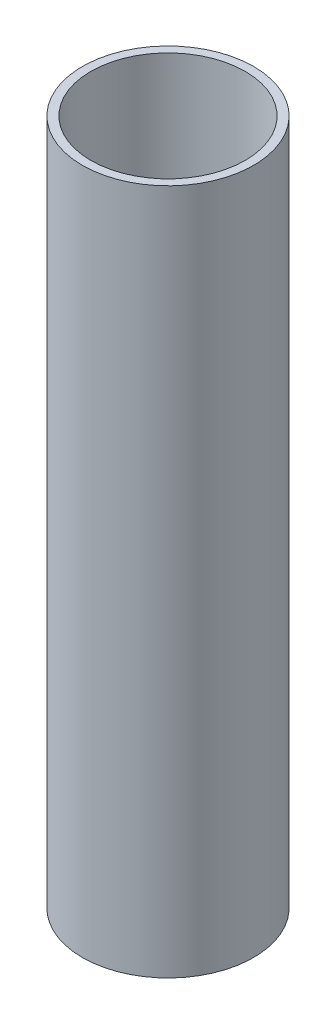
ISO-10303-21;
HEADER;
FILE_DESCRIPTION(('STEP AP214'),'2;1');
FILE_NAME('part.step','',(''),(''),'','','');
FILE_SCHEMA(('AUTOMOTIVE_DESIGN { 1 0 10303 214 1 1 1 1 }'));
ENDSEC;
DATA;
#1=APPLICATION_CONTEXT('core data for automotive mechanical design processes');
#2=APPLICATION_PROTOCOL_DEFINITION('international standard','automotive_design',2000,#1);
#3=PRODUCT_CONTEXT('',#1,'mechanical');
#4=PRODUCT('Part','Part','',(#3));
#5=PRODUCT_RELATED_PRODUCT_CATEGORY('part','',(#4));
#6=PRODUCT_DEFINITION_FORMATION('','',#4);
#7=PRODUCT_DEFINITION_CONTEXT('part definition',#1,'design');
#8=PRODUCT_DEFINITION('design','',#6,#7);
#9=PRODUCT_DEFINITION_SHAPE('','',#8);
#10=(LENGTH_UNIT() NAMED_UNIT(*) SI_UNIT(.MILLI.,.METRE.));
#11=(NAMED_UNIT(*) PLANE_ANGLE_UNIT() SI_UNIT($,.RADIAN.));
#12=(NAMED_UNIT(*) SI_UNIT($,.STERADIAN.) SOLID_ANGLE_UNIT());
#13=UNCERTAINTY_MEASURE_WITH_UNIT(LENGTH_MEASURE(1.E-05),#10,'distance_accuracy_value','');
#14=(GEOMETRIC_REPRESENTATION_CONTEXT(3) GLOBAL_UNCERTAINTY_ASSIGNED_CONTEXT((#13)) GLOBAL_UNIT_ASSIGNED_CONTEXT((#10,
#11,#12)) REPRESENTATION_CONTEXT('',''));
#15=CARTESIAN_POINT('',(0.,0.,0.));
#16=DIRECTION('',(0.,0.,1.));
#17=DIRECTION('',(1.,0.,0.));
#18=AXIS2_PLACEMENT_3D('',#15,#16,#17);
#19=CARTESIAN_POINT('',(0.,406.4,0.));
#20=DIRECTION('',(0.,1.,0.));
#21=DIRECTION('',(0.,0.,1.));
#22=AXIS2_PLACEMENT_3D('',#19,#20,#21);
#23=PLANE('',#22);
#24=CARTESIAN_POINT('',(0.,406.4,0.));
#25=DIRECTION('',(0.,1.,0.));
#26=DIRECTION('',(0.,0.,1.));
#27=AXIS2_PLACEMENT_3D('',#24,#25,#26);
#28=CIRCLE('',#27,50.7348979291605);
#29=CARTESIAN_POINT('',(0.,406.4,50.7348979291605));
#30=VERTEX_POINT('',#29);
#31=EDGE_CURVE('E10',#30,#30,#28,.T.);
#32=ORIENTED_EDGE('',*,*,#31,.T.);
#33=EDGE_LOOP('',(#32));
#34=FACE_BOUND('',#33,.T.);
#35=CARTESIAN_POINT('',(0.,406.4,0.));
#36=DIRECTION('',(0.,1.,0.));
#37=DIRECTION('',(0.,0.,1.));
#38=AXIS2_PLACEMENT_3D('',#35,#36,#37);
#39=CIRCLE('',#38,45.72);
#40=CARTESIAN_POINT('',(0.,406.4,45.72));
#41=VERTEX_POINT('',#40);
#42=EDGE_CURVE('E42',#41,#41,#39,.T.);
#43=ORIENTED_EDGE('',*,*,#42,.F.);
#44=EDGE_LOOP('',(#43));
#45=FACE_BOUND('',#44,.T.);
#46=ADVANCED_FACE('F31',(#34,#45),#23,.T.);
#47=CARTESIAN_POINT('',(0.,0.,0.));
#48=DIRECTION('',(0.,1.,0.));
#49=DIRECTION('',(0.,0.,1.));
#50=AXIS2_PLACEMENT_3D('',#47,#48,#49);
#51=PLANE('',#50);
#52=CARTESIAN_POINT('',(0.,0.,0.));
#53=DIRECTION('',(0.,1.,0.));
#54=DIRECTION('',(0.,0.,1.));
#55=AXIS2_PLACEMENT_3D('',#52,#53,#54);
#56=CIRCLE('',#55,50.7348979291605);
#57=CARTESIAN_POINT('',(0.,0.,50.7348979291605));
#58=VERTEX_POINT('',#57);
#59=EDGE_CURVE('E35',#58,#58,#56,.T.);
#60=ORIENTED_EDGE('',*,*,#59,.F.);
#61=EDGE_LOOP('',(#60));
#62=FACE_BOUND('',#61,.T.);
#63=CARTESIAN_POINT('',(0.,0.,0.));
#64=DIRECTION('',(0.,1.,0.));
#65=DIRECTION('',(0.,0.,1.));
#66=AXIS2_PLACEMENT_3D('',#63,#64,#65);
#67=CIRCLE('',#66,45.72);
#68=CARTESIAN_POINT('',(0.,0.,45.72));
#69=VERTEX_POINT('',#68);
#70=EDGE_CURVE('E44',#69,#69,#67,.T.);
#71=ORIENTED_EDGE('',*,*,#70,.T.);
#72=EDGE_LOOP('',(#71));
#73=FACE_BOUND('',#72,.T.);
#74=ADVANCED_FACE('F54',(#62,#73),#51,.F.);
#75=CARTESIAN_POINT('',(0.,406.4,0.));
#76=DIRECTION('',(0.,-1.,0.));
#77=DIRECTION('',(0.,0.,-1.));
#78=AXIS2_PLACEMENT_3D('',#75,#76,#77);
#79=CYLINDRICAL_SURFACE('',#78,50.7348979291605);
#80=ORIENTED_EDGE('',*,*,#31,.F.);
#81=EDGE_LOOP('',(#80));
#82=FACE_BOUND('',#81,.T.);
#83=ORIENTED_EDGE('',*,*,#59,.T.);
#84=EDGE_LOOP('',(#83));
#85=FACE_BOUND('',#84,.T.);
#86=ADVANCED_FACE('F33',(#82,#85),#79,.T.);
#87=CARTESIAN_POINT('',(0.,406.4,0.));
#88=DIRECTION('',(0.,-1.,0.));
#89=DIRECTION('',(0.,0.,-1.));
#90=AXIS2_PLACEMENT_3D('',#87,#88,#89);
#91=CYLINDRICAL_SURFACE('',#90,45.72);
#92=ORIENTED_EDGE('',*,*,#42,.T.);
#93=EDGE_LOOP('',(#92));
#94=FACE_BOUND('',#93,.T.);
#95=ORIENTED_EDGE('',*,*,#70,.F.);
#96=EDGE_LOOP('',(#95));
#97=FACE_BOUND('',#96,.T.);
#98=ADVANCED_FACE('F50',(#94,#97),#91,.F.);
#99=CLOSED_SHELL('',(#46,#74,#86,#98));
#100=MANIFOLD_SOLID_BREP('B2',#99);
#101=ADVANCED_BREP_SHAPE_REPRESENTATION('',(#18,#100),#14);
#102=SHAPE_DEFINITION_REPRESENTATION(#9,#101);
ENDSEC;
END-ISO-10303-21;
